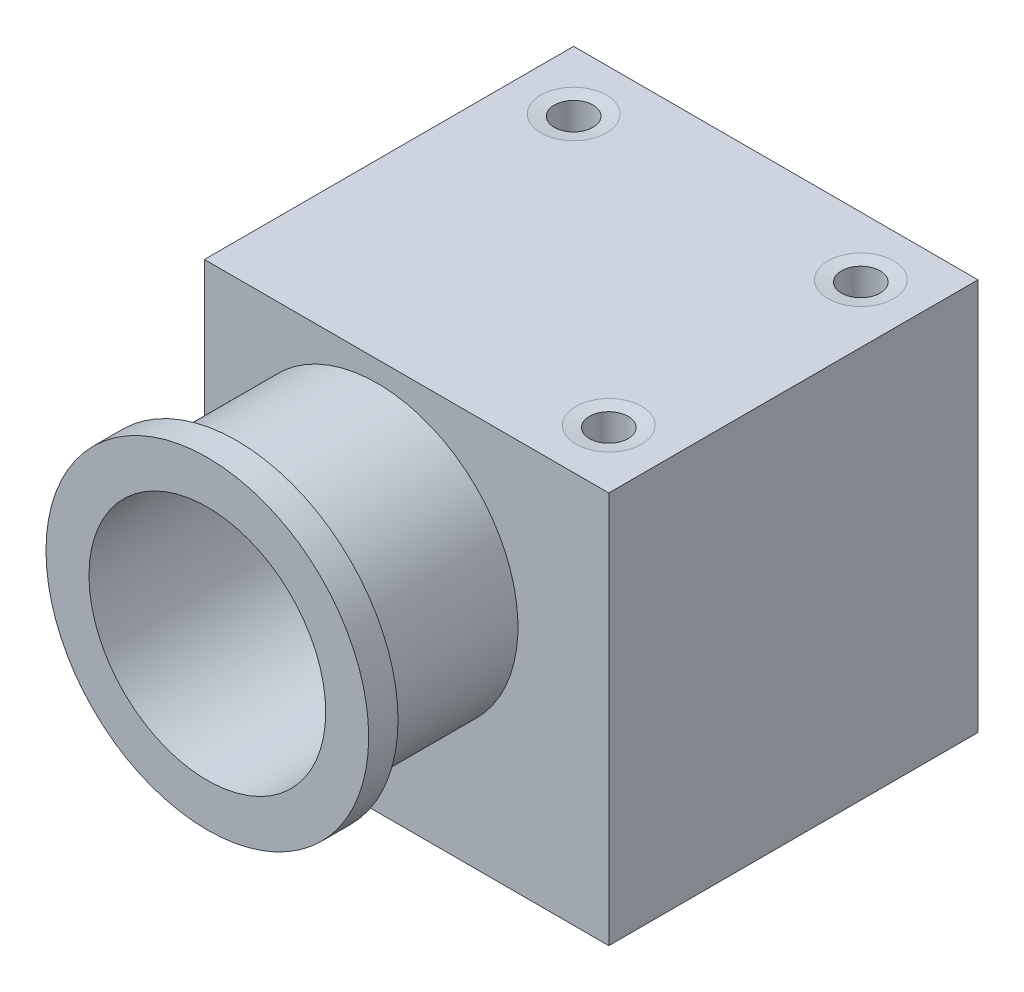
ISO-10303-21;
HEADER;
FILE_DESCRIPTION(('STEP AP214'),'2;1');
FILE_NAME('part.step','',(''),(''),'','','');
FILE_SCHEMA(('AUTOMOTIVE_DESIGN { 1 0 10303 214 1 1 1 1 }'));
ENDSEC;
DATA;
#1=APPLICATION_CONTEXT('core data for automotive mechanical design processes');
#2=APPLICATION_PROTOCOL_DEFINITION('international standard','automotive_design',2000,#1);
#3=PRODUCT_CONTEXT('',#1,'mechanical');
#4=PRODUCT('Part','Part','',(#3));
#5=PRODUCT_RELATED_PRODUCT_CATEGORY('part','',(#4));
#6=PRODUCT_DEFINITION_FORMATION('','',#4);
#7=PRODUCT_DEFINITION_CONTEXT('part definition',#1,'design');
#8=PRODUCT_DEFINITION('design','',#6,#7);
#9=PRODUCT_DEFINITION_SHAPE('','',#8);
#10=(LENGTH_UNIT() NAMED_UNIT(*) SI_UNIT(.MILLI.,.METRE.));
#11=(NAMED_UNIT(*) PLANE_ANGLE_UNIT() SI_UNIT($,.RADIAN.));
#12=(NAMED_UNIT(*) SI_UNIT($,.STERADIAN.) SOLID_ANGLE_UNIT());
#13=UNCERTAINTY_MEASURE_WITH_UNIT(LENGTH_MEASURE(1.E-05),#10,'distance_accuracy_value','');
#14=(GEOMETRIC_REPRESENTATION_CONTEXT(3) GLOBAL_UNCERTAINTY_ASSIGNED_CONTEXT((#13)) GLOBAL_UNIT_ASSIGNED_CONTEXT((#10,
#11,#12)) REPRESENTATION_CONTEXT('',''));
#15=CARTESIAN_POINT('',(0.,0.,0.));
#16=DIRECTION('',(0.,0.,1.));
#17=DIRECTION('',(1.,0.,0.));
#18=AXIS2_PLACEMENT_3D('',#15,#16,#17);
#19=CARTESIAN_POINT('',(0.,1.50369999999999,-18.288));
#20=DIRECTION('',(0.,0.,1.));
#21=DIRECTION('',(1.,0.,0.));
#22=AXIS2_PLACEMENT_3D('',#19,#20,#21);
#23=CYLINDRICAL_SURFACE('',#22,5.1308);
#24=CARTESIAN_POINT('',(0.,1.50369999999999,-18.2626));
#25=DIRECTION('',(0.,0.,-1.));
#26=DIRECTION('',(-1.,0.,0.));
#27=AXIS2_PLACEMENT_3D('',#24,#25,#26);
#28=CIRCLE('',#27,5.1308);
#29=CARTESIAN_POINT('',(-5.1308,1.50369999999999,-18.2626));
#30=VERTEX_POINT('',#29);
#31=EDGE_CURVE('E43',#30,#30,#28,.F.);
#32=ORIENTED_EDGE('',*,*,#31,.T.);
#33=EDGE_LOOP('',(#32));
#34=FACE_BOUND('',#33,.T.);
#35=CARTESIAN_POINT('',(0.,1.50369999999999,-18.288));
#36=DIRECTION('',(0.,0.,1.));
#37=DIRECTION('',(1.,0.,0.));
#38=AXIS2_PLACEMENT_3D('',#35,#36,#37);
#39=CIRCLE('',#38,5.1308);
#40=CARTESIAN_POINT('',(5.1308,1.50369999999999,-18.288));
#41=VERTEX_POINT('',#40);
#42=EDGE_CURVE('E200',#41,#41,#39,.T.);
#43=ORIENTED_EDGE('',*,*,#42,.F.);
#44=EDGE_LOOP('',(#43));
#45=FACE_BOUND('',#44,.T.);
#46=ADVANCED_FACE('F39',(#34,#45),#23,.F.);
#47=CARTESIAN_POINT('',(-7.493,-8.49630000000001,-24.1554));
#48=DIRECTION('',(1.,0.,0.));
#49=DIRECTION('',(0.,0.,-1.));
#50=AXIS2_PLACEMENT_3D('',#47,#48,#49);
#51=PLANE('',#50);
#52=DIRECTION('',(0.,1.,0.));
#53=VECTOR('',#52,1.);
#54=CARTESIAN_POINT('',(-7.493,-8.49630000000001,-23.368));
#55=LINE('',#54,#53);
#56=CARTESIAN_POINT('',(-7.493,-8.49630000000001,-23.368));
#57=VERTEX_POINT('',#56);
#58=CARTESIAN_POINT('',(-7.493,8.49629999999999,-23.368));
#59=VERTEX_POINT('',#58);
#60=EDGE_CURVE('E171',#57,#59,#55,.T.);
#61=ORIENTED_EDGE('',*,*,#60,.F.);
#62=DIRECTION('',(0.,0.,1.));
#63=VECTOR('',#62,1.);
#64=CARTESIAN_POINT('',(-7.493,-8.49630000000001,-24.1554));
#65=LINE('',#64,#63);
#66=CARTESIAN_POINT('',(-7.493,-8.49630000000001,-7.366));
#67=VERTEX_POINT('',#66);
#68=EDGE_CURVE('E48',#57,#67,#65,.T.);
#69=ORIENTED_EDGE('',*,*,#68,.T.);
#70=DIRECTION('',(0.,-1.,0.));
#71=VECTOR('',#70,1.);
#72=CARTESIAN_POINT('',(-7.493,8.49629999999999,-7.366));
#73=LINE('',#72,#71);
#74=CARTESIAN_POINT('',(-7.493,8.49629999999999,-7.366));
#75=VERTEX_POINT('',#74);
#76=EDGE_CURVE('E191',#75,#67,#73,.T.);
#77=ORIENTED_EDGE('',*,*,#76,.F.);
#78=DIRECTION('',(0.,0.,1.));
#79=VECTOR('',#78,1.);
#80=CARTESIAN_POINT('',(-7.493,8.49629999999999,-24.1554));
#81=LINE('',#80,#79);
#82=EDGE_CURVE('E11',#59,#75,#81,.T.);
#83=ORIENTED_EDGE('',*,*,#82,.F.);
#84=EDGE_LOOP('',(#61,#69,#77,#83));
#85=FACE_BOUND('',#84,.T.);
#86=ADVANCED_FACE('F41',(#85),#51,.F.);
#87=CARTESIAN_POINT('',(-7.493,8.49629999999999,-24.1554));
#88=DIRECTION('',(0.,-1.,0.));
#89=DIRECTION('',(0.,0.,-1.));
#90=AXIS2_PLACEMENT_3D('',#87,#88,#89);
#91=PLANE('',#90);
#92=CARTESIAN_POINT('',(7.493,8.49629999999999,-9.906));
#93=DIRECTION('',(0.,1.,0.));
#94=DIRECTION('',(0.,0.,1.));
#95=AXIS2_PLACEMENT_3D('',#92,#93,#94);
#96=CIRCLE('',#95,1.4224);
#97=CARTESIAN_POINT('',(7.493,8.49629999999999,-8.4836));
#98=VERTEX_POINT('',#97);
#99=EDGE_CURVE('E146',#98,#98,#96,.T.);
#100=ORIENTED_EDGE('',*,*,#99,.F.);
#101=EDGE_LOOP('',(#100));
#102=FACE_BOUND('',#101,.T.);
#103=CARTESIAN_POINT('',(7.493,8.49629999999999,-20.828));
#104=DIRECTION('',(0.,1.,0.));
#105=DIRECTION('',(0.,0.,1.));
#106=AXIS2_PLACEMENT_3D('',#103,#104,#105);
#107=CIRCLE('',#106,1.4224);
#108=CARTESIAN_POINT('',(7.493,8.49629999999999,-19.4056));
#109=VERTEX_POINT('',#108);
#110=EDGE_CURVE('E150',#109,#109,#107,.T.);
#111=ORIENTED_EDGE('',*,*,#110,.F.);
#112=EDGE_LOOP('',(#111));
#113=FACE_BOUND('',#112,.T.);
#114=CARTESIAN_POINT('',(-4.953,8.49629999999999,-20.828));
#115=DIRECTION('',(0.,1.,0.));
#116=DIRECTION('',(0.,0.,1.));
#117=AXIS2_PLACEMENT_3D('',#114,#115,#116);
#118=CIRCLE('',#117,1.4224);
#119=CARTESIAN_POINT('',(-4.953,8.49629999999999,-19.4056));
#120=VERTEX_POINT('',#119);
#121=EDGE_CURVE('E154',#120,#120,#118,.T.);
#122=ORIENTED_EDGE('',*,*,#121,.F.);
#123=EDGE_LOOP('',(#122));
#124=FACE_BOUND('',#123,.T.);
#125=DIRECTION('',(1.,0.,0.));
#126=VECTOR('',#125,1.);
#127=CARTESIAN_POINT('',(-7.493,8.49629999999999,-23.368));
#128=LINE('',#127,#126);
#129=CARTESIAN_POINT('',(10.033,8.49629999999999,-23.368));
#130=VERTEX_POINT('',#129);
#131=EDGE_CURVE('E173',#59,#130,#128,.T.);
#132=ORIENTED_EDGE('',*,*,#131,.F.);
#133=ORIENTED_EDGE('',*,*,#82,.T.);
#134=DIRECTION('',(-1.,0.,0.));
#135=VECTOR('',#134,1.);
#136=CARTESIAN_POINT('',(-7.493,8.49629999999999,-7.366));
#137=LINE('',#136,#135);
#138=CARTESIAN_POINT('',(10.033,8.49629999999999,-7.366));
#139=VERTEX_POINT('',#138);
#140=EDGE_CURVE('E197',#139,#75,#137,.T.);
#141=ORIENTED_EDGE('',*,*,#140,.F.);
#142=DIRECTION('',(0.,0.,1.));
#143=VECTOR('',#142,1.);
#144=CARTESIAN_POINT('',(10.033,8.49629999999999,-7.366));
#145=LINE('',#144,#143);
#146=EDGE_CURVE('E168',#130,#139,#145,.T.);
#147=ORIENTED_EDGE('',*,*,#146,.F.);
#148=EDGE_LOOP('',(#132,#133,#141,#147));
#149=FACE_BOUND('',#148,.T.);
#150=ADVANCED_FACE('F257',(#102,#113,#124,#149),#91,.F.);
#151=CARTESIAN_POINT('',(-7.493,-8.49630000000001,-24.1554));
#152=DIRECTION('',(0.,-1.,0.));
#153=DIRECTION('',(0.,0.,-1.));
#154=AXIS2_PLACEMENT_3D('',#151,#152,#153);
#155=PLANE('',#154);
#156=DIRECTION('',(0.,0.,1.));
#157=VECTOR('',#156,1.);
#158=CARTESIAN_POINT('',(6.59129999999998,-8.49630000000001,-18.2626));
#159=LINE('',#158,#157);
#160=CARTESIAN_POINT('',(6.59129999999998,-8.49630000000001,-18.2626));
#161=VERTEX_POINT('',#160);
#162=CARTESIAN_POINT('',(6.59129999999998,-8.49630000000001,-17.4752));
#163=VERTEX_POINT('',#162);
#164=EDGE_CURVE('E56',#161,#163,#159,.T.);
#165=ORIENTED_EDGE('',*,*,#164,.F.);
#166=DIRECTION('',(1.,0.,0.));
#167=VECTOR('',#166,1.);
#168=CARTESIAN_POINT('',(-6.59130000000002,-8.49630000000001,-18.2626));
#169=LINE('',#168,#167);
#170=CARTESIAN_POINT('',(-6.59130000000002,-8.49630000000001,-18.2626));
#171=VERTEX_POINT('',#170);
#172=EDGE_CURVE('E127',#171,#161,#169,.T.);
#173=ORIENTED_EDGE('',*,*,#172,.F.);
#174=DIRECTION('',(0.,0.,-1.));
#175=VECTOR('',#174,1.);
#176=CARTESIAN_POINT('',(-6.59130000000002,-8.49630000000001,-18.2626));
#177=LINE('',#176,#175);
#178=CARTESIAN_POINT('',(-6.59130000000002,-8.49630000000001,-17.4752));
#179=VERTEX_POINT('',#178);
#180=EDGE_CURVE('E130',#179,#171,#177,.T.);
#181=ORIENTED_EDGE('',*,*,#180,.F.);
#182=DIRECTION('',(-1.,0.,0.));
#183=VECTOR('',#182,1.);
#184=CARTESIAN_POINT('',(-6.59130000000002,-8.49630000000001,-17.4752));
#185=LINE('',#184,#183);
#186=EDGE_CURVE('E136',#163,#179,#185,.T.);
#187=ORIENTED_EDGE('',*,*,#186,.F.);
#188=EDGE_LOOP('',(#165,#173,#181,#187));
#189=FACE_BOUND('',#188,.T.);
#190=CARTESIAN_POINT('',(7.493,-8.49630000000001,-9.906));
#191=DIRECTION('',(0.,-1.,0.));
#192=DIRECTION('',(0.,0.,-1.));
#193=AXIS2_PLACEMENT_3D('',#190,#191,#192);
#194=CIRCLE('',#193,0.838200000000001);
#195=CARTESIAN_POINT('',(7.493,-8.49630000000001,-10.7442));
#196=VERTEX_POINT('',#195);
#197=EDGE_CURVE('E220',#196,#196,#194,.T.);
#198=ORIENTED_EDGE('',*,*,#197,.F.);
#199=EDGE_LOOP('',(#198));
#200=FACE_BOUND('',#199,.T.);
#201=CARTESIAN_POINT('',(7.493,-8.49630000000001,-20.828));
#202=DIRECTION('',(0.,-1.,0.));
#203=DIRECTION('',(0.,0.,-1.));
#204=AXIS2_PLACEMENT_3D('',#201,#202,#203);
#205=CIRCLE('',#204,0.838200000000001);
#206=CARTESIAN_POINT('',(7.493,-8.49630000000001,-21.6662));
#207=VERTEX_POINT('',#206);
#208=EDGE_CURVE('E217',#207,#207,#205,.T.);
#209=ORIENTED_EDGE('',*,*,#208,.F.);
#210=EDGE_LOOP('',(#209));
#211=FACE_BOUND('',#210,.T.);
#212=CARTESIAN_POINT('',(-4.953,-8.49630000000001,-20.828));
#213=DIRECTION('',(0.,-1.,0.));
#214=DIRECTION('',(0.,0.,-1.));
#215=AXIS2_PLACEMENT_3D('',#212,#213,#214);
#216=CIRCLE('',#215,0.8382);
#217=CARTESIAN_POINT('',(-4.953,-8.49630000000001,-21.6662));
#218=VERTEX_POINT('',#217);
#219=EDGE_CURVE('E162',#218,#218,#216,.T.);
#220=ORIENTED_EDGE('',*,*,#219,.F.);
#221=EDGE_LOOP('',(#220));
#222=FACE_BOUND('',#221,.T.);
#223=ORIENTED_EDGE('',*,*,#68,.F.);
#224=DIRECTION('',(-1.,0.,0.));
#225=VECTOR('',#224,1.);
#226=CARTESIAN_POINT('',(-7.493,-8.49630000000001,-23.368));
#227=LINE('',#226,#225);
#228=CARTESIAN_POINT('',(10.033,-8.49630000000001,-23.368));
#229=VERTEX_POINT('',#228);
#230=EDGE_CURVE('E175',#229,#57,#227,.T.);
#231=ORIENTED_EDGE('',*,*,#230,.F.);
#232=DIRECTION('',(0.,0.,-1.));
#233=VECTOR('',#232,1.);
#234=CARTESIAN_POINT('',(10.033,-8.49630000000001,-7.366));
#235=LINE('',#234,#233);
#236=CARTESIAN_POINT('',(10.033,-8.49630000000001,-7.366));
#237=VERTEX_POINT('',#236);
#238=EDGE_CURVE('E161',#237,#229,#235,.T.);
#239=ORIENTED_EDGE('',*,*,#238,.F.);
#240=DIRECTION('',(1.,0.,0.));
#241=VECTOR('',#240,1.);
#242=CARTESIAN_POINT('',(-7.493,-8.49630000000001,-7.366));
#243=LINE('',#242,#241);
#244=EDGE_CURVE('E195',#67,#237,#243,.T.);
#245=ORIENTED_EDGE('',*,*,#244,.F.);
#246=EDGE_LOOP('',(#223,#231,#239,#245));
#247=FACE_BOUND('',#246,.T.);
#248=ADVANCED_FACE('F314',(#189,#200,#211,#222,#247),#155,.T.);
#249=CARTESIAN_POINT('',(0.,1.50369999999999,-24.1554));
#250=DIRECTION('',(0.,0.,1.));
#251=DIRECTION('',(1.,0.,0.));
#252=AXIS2_PLACEMENT_3D('',#249,#250,#251);
#253=CYLINDRICAL_SURFACE('',#252,1.4224);
#254=CARTESIAN_POINT('',(0.,1.50369999999999,-19.558));
#255=DIRECTION('',(0.,0.,1.));
#256=DIRECTION('',(1.,0.,0.));
#257=AXIS2_PLACEMENT_3D('',#254,#255,#256);
#258=CIRCLE('',#257,1.4224);
#259=CARTESIAN_POINT('',(1.4224,1.50369999999999,-19.558));
#260=VERTEX_POINT('',#259);
#261=EDGE_CURVE('E207',#260,#260,#258,.F.);
#262=ORIENTED_EDGE('',*,*,#261,.F.);
#263=EDGE_LOOP('',(#262));
#264=FACE_BOUND('',#263,.T.);
#265=CARTESIAN_POINT('',(0.,1.50369999999999,-23.368));
#266=DIRECTION('',(0.,0.,-1.));
#267=DIRECTION('',(-1.,0.,0.));
#268=AXIS2_PLACEMENT_3D('',#265,#266,#267);
#269=CIRCLE('',#268,1.4224);
#270=CARTESIAN_POINT('',(-1.4224,1.50369999999999,-23.368));
#271=VERTEX_POINT('',#270);
#272=EDGE_CURVE('E177',#271,#271,#269,.F.);
#273=ORIENTED_EDGE('',*,*,#272,.F.);
#274=EDGE_LOOP('',(#273));
#275=FACE_BOUND('',#274,.T.);
#276=ADVANCED_FACE('F270',(#264,#275),#253,.F.);
#277=CARTESIAN_POINT('',(0.,0.,-7.366));
#278=DIRECTION('',(0.,0.,1.));
#279=DIRECTION('',(1.,0.,0.));
#280=AXIS2_PLACEMENT_3D('',#277,#278,#279);
#281=PLANE('',#280);
#282=ORIENTED_EDGE('',*,*,#76,.T.);
#283=ORIENTED_EDGE('',*,*,#244,.T.);
#284=DIRECTION('',(0.,-1.,0.));
#285=VECTOR('',#284,1.);
#286=CARTESIAN_POINT('',(10.033,8.49629999999999,-7.366));
#287=LINE('',#286,#285);
#288=EDGE_CURVE('E158',#139,#237,#287,.T.);
#289=ORIENTED_EDGE('',*,*,#288,.F.);
#290=ORIENTED_EDGE('',*,*,#140,.T.);
#291=EDGE_LOOP('',(#282,#283,#289,#290));
#292=FACE_BOUND('',#291,.T.);
#293=CARTESIAN_POINT('',(0.,1.50369999999999,-7.366));
#294=DIRECTION('',(0.,0.,1.));
#295=DIRECTION('',(1.,0.,0.));
#296=AXIS2_PLACEMENT_3D('',#293,#294,#295);
#297=CIRCLE('',#296,6.096);
#298=CARTESIAN_POINT('',(-6.096,1.50369999999999,-7.366));
#299=VERTEX_POINT('',#298);
#300=EDGE_CURVE('E185',#299,#299,#297,.T.);
#301=ORIENTED_EDGE('',*,*,#300,.F.);
#302=EDGE_LOOP('',(#301));
#303=FACE_BOUND('',#302,.T.);
#304=ADVANCED_FACE('F262',(#292,#303),#281,.T.);
#305=CARTESIAN_POINT('',(0.,1.50369999999999,-17.4752));
#306=DIRECTION('',(0.,0.,1.));
#307=DIRECTION('',(1.,0.,0.));
#308=AXIS2_PLACEMENT_3D('',#305,#306,#307);
#309=CIRCLE('',#308,5.1308);
#310=CARTESIAN_POINT('',(5.1308,1.50369999999999,-17.4752));
#311=VERTEX_POINT('',#310);
#312=EDGE_CURVE('E142',#311,#311,#309,.F.);
#313=ORIENTED_EDGE('',*,*,#312,.T.);
#314=EDGE_LOOP('',(#313));
#315=FACE_BOUND('',#314,.T.);
#316=CARTESIAN_POINT('',(0.,1.50369999999999,0.));
#317=DIRECTION('',(0.,0.,1.));
#318=DIRECTION('',(1.,0.,0.));
#319=AXIS2_PLACEMENT_3D('',#316,#317,#318);
#320=CIRCLE('',#319,5.1308);
#321=CARTESIAN_POINT('',(5.1308,1.50369999999999,0.));
#322=VERTEX_POINT('',#321);
#323=EDGE_CURVE('E178',#322,#322,#320,.T.);
#324=ORIENTED_EDGE('',*,*,#323,.T.);
#325=EDGE_LOOP('',(#324));
#326=FACE_BOUND('',#325,.T.);
#327=ADVANCED_FACE('F253',(#315,#326),#23,.F.);
#328=CARTESIAN_POINT('',(0.,1.50369999999999,-19.558));
#329=DIRECTION('',(0.,0.,1.));
#330=DIRECTION('',(1.,0.,0.));
#331=AXIS2_PLACEMENT_3D('',#328,#329,#330);
#332=CYLINDRICAL_SURFACE('',#331,3.2639);
#333=CARTESIAN_POINT('',(0.,1.50369999999999,-19.558));
#334=DIRECTION('',(0.,0.,1.));
#335=DIRECTION('',(1.,0.,0.));
#336=AXIS2_PLACEMENT_3D('',#333,#334,#335);
#337=CIRCLE('',#336,3.2639);
#338=CARTESIAN_POINT('',(3.2639,1.50369999999999,-19.558));
#339=VERTEX_POINT('',#338);
#340=EDGE_CURVE('E204',#339,#339,#337,.T.);
#341=ORIENTED_EDGE('',*,*,#340,.F.);
#342=EDGE_LOOP('',(#341));
#343=FACE_BOUND('',#342,.T.);
#344=CARTESIAN_POINT('',(0.,1.50369999999999,-18.288));
#345=DIRECTION('',(0.,0.,1.));
#346=DIRECTION('',(1.,0.,0.));
#347=AXIS2_PLACEMENT_3D('',#344,#345,#346);
#348=CIRCLE('',#347,3.2639);
#349=CARTESIAN_POINT('',(3.2639,1.50369999999999,-18.288));
#350=VERTEX_POINT('',#349);
#351=EDGE_CURVE('E203',#350,#350,#348,.F.);
#352=ORIENTED_EDGE('',*,*,#351,.F.);
#353=EDGE_LOOP('',(#352));
#354=FACE_BOUND('',#353,.T.);
#355=ADVANCED_FACE('F261',(#343,#354),#332,.F.);
#356=CARTESIAN_POINT('',(0.,1.50369999999999,-19.558));
#357=DIRECTION('',(0.,0.,1.));
#358=DIRECTION('',(1.,0.,0.));
#359=AXIS2_PLACEMENT_3D('',#356,#357,#358);
#360=PLANE('',#359);
#361=ORIENTED_EDGE('',*,*,#340,.T.);
#362=EDGE_LOOP('',(#361));
#363=FACE_BOUND('',#362,.T.);
#364=ORIENTED_EDGE('',*,*,#261,.T.);
#365=EDGE_LOOP('',(#364));
#366=FACE_BOUND('',#365,.T.);
#367=ADVANCED_FACE('F267',(#363,#366),#360,.T.);
#368=CARTESIAN_POINT('',(0.,1.50369999999999,-18.288));
#369=DIRECTION('',(0.,0.,1.));
#370=DIRECTION('',(1.,0.,0.));
#371=AXIS2_PLACEMENT_3D('',#368,#369,#370);
#372=PLANE('',#371);
#373=ORIENTED_EDGE('',*,*,#42,.T.);
#374=EDGE_LOOP('',(#373));
#375=FACE_BOUND('',#374,.T.);
#376=ORIENTED_EDGE('',*,*,#351,.T.);
#377=EDGE_LOOP('',(#376));
#378=FACE_BOUND('',#377,.T.);
#379=ADVANCED_FACE('F296',(#375,#378),#372,.T.);
#380=CARTESIAN_POINT('',(0.,1.50369999999999,-1.27));
#381=DIRECTION('',(0.,0.,-1.));
#382=DIRECTION('',(-1.,0.,0.));
#383=AXIS2_PLACEMENT_3D('',#380,#381,#382);
#384=CYLINDRICAL_SURFACE('',#383,6.096);
#385=CARTESIAN_POINT('',(0.,1.50369999999999,-1.27));
#386=DIRECTION('',(0.,0.,1.));
#387=DIRECTION('',(1.,0.,0.));
#388=AXIS2_PLACEMENT_3D('',#385,#386,#387);
#389=CIRCLE('',#388,6.096);
#390=CARTESIAN_POINT('',(-6.096,1.50369999999999,-1.27));
#391=VERTEX_POINT('',#390);
#392=EDGE_CURVE('E188',#391,#391,#389,.T.);
#393=CARTESIAN_POINT('',(-6.096,1.50369999999999,-1.27));
#394=CARTESIAN_POINT('',(-6.096,1.50369999999999,-1.3335));
#395=CARTESIAN_POINT('',(-6.096,1.50369999999999,-1.397));
#396=CARTESIAN_POINT('',(-6.096,1.50369999999999,-1.524));
#397=CARTESIAN_POINT('',(-6.096,1.50369999999999,-1.5875));
#398=CARTESIAN_POINT('',(-6.096,1.50369999999999,-1.7145));
#399=CARTESIAN_POINT('',(-6.096,1.50369999999999,-1.778));
#400=CARTESIAN_POINT('',(-6.096,1.50369999999999,-1.905));
#401=CARTESIAN_POINT('',(-6.096,1.50369999999999,-1.9685));
#402=CARTESIAN_POINT('',(-6.096,1.50369999999999,-2.0955));
#403=CARTESIAN_POINT('',(-6.096,1.50369999999999,-2.159));
#404=CARTESIAN_POINT('',(-6.096,1.50369999999999,-2.286));
#405=CARTESIAN_POINT('',(-6.096,1.50369999999999,-2.3495));
#406=CARTESIAN_POINT('',(-6.096,1.50369999999999,-2.4765));
#407=CARTESIAN_POINT('',(-6.096,1.50369999999999,-2.54));
#408=CARTESIAN_POINT('',(-6.096,1.50369999999999,-2.667));
#409=CARTESIAN_POINT('',(-6.096,1.50369999999999,-2.7305));
#410=CARTESIAN_POINT('',(-6.096,1.50369999999999,-2.8575));
#411=CARTESIAN_POINT('',(-6.096,1.50369999999999,-2.921));
#412=CARTESIAN_POINT('',(-6.096,1.50369999999999,-3.048));
#413=CARTESIAN_POINT('',(-6.096,1.50369999999999,-3.1115));
#414=CARTESIAN_POINT('',(-6.096,1.50369999999999,-3.2385));
#415=CARTESIAN_POINT('',(-6.096,1.50369999999999,-3.302));
#416=CARTESIAN_POINT('',(-6.096,1.50369999999999,-3.429));
#417=CARTESIAN_POINT('',(-6.096,1.50369999999999,-3.4925));
#418=CARTESIAN_POINT('',(-6.096,1.50369999999999,-3.6195));
#419=CARTESIAN_POINT('',(-6.096,1.50369999999999,-3.683));
#420=CARTESIAN_POINT('',(-6.096,1.50369999999999,-3.81));
#421=CARTESIAN_POINT('',(-6.096,1.50369999999999,-3.8735));
#422=CARTESIAN_POINT('',(-6.096,1.50369999999999,-4.0005));
#423=CARTESIAN_POINT('',(-6.096,1.50369999999999,-4.064));
#424=CARTESIAN_POINT('',(-6.096,1.50369999999999,-4.191));
#425=CARTESIAN_POINT('',(-6.096,1.50369999999999,-4.2545));
#426=CARTESIAN_POINT('',(-6.096,1.50369999999999,-4.3815));
#427=CARTESIAN_POINT('',(-6.096,1.50369999999999,-4.445));
#428=CARTESIAN_POINT('',(-6.096,1.50369999999999,-4.572));
#429=CARTESIAN_POINT('',(-6.096,1.50369999999999,-4.6355));
#430=CARTESIAN_POINT('',(-6.096,1.50369999999999,-4.7625));
#431=CARTESIAN_POINT('',(-6.096,1.50369999999999,-4.826));
#432=CARTESIAN_POINT('',(-6.096,1.50369999999999,-4.953));
#433=CARTESIAN_POINT('',(-6.096,1.50369999999999,-5.0165));
#434=CARTESIAN_POINT('',(-6.096,1.50369999999999,-5.1435));
#435=CARTESIAN_POINT('',(-6.096,1.50369999999999,-5.207));
#436=CARTESIAN_POINT('',(-6.096,1.50369999999999,-5.334));
#437=CARTESIAN_POINT('',(-6.096,1.50369999999999,-5.3975));
#438=CARTESIAN_POINT('',(-6.096,1.50369999999999,-5.5245));
#439=CARTESIAN_POINT('',(-6.096,1.50369999999999,-5.588));
#440=CARTESIAN_POINT('',(-6.096,1.50369999999999,-5.715));
#441=CARTESIAN_POINT('',(-6.096,1.50369999999999,-5.7785));
#442=CARTESIAN_POINT('',(-6.096,1.50369999999999,-5.9055));
#443=CARTESIAN_POINT('',(-6.096,1.50369999999999,-5.969));
#444=CARTESIAN_POINT('',(-6.096,1.50369999999999,-6.096));
#445=CARTESIAN_POINT('',(-6.096,1.50369999999999,-6.1595));
#446=CARTESIAN_POINT('',(-6.096,1.50369999999999,-6.2865));
#447=CARTESIAN_POINT('',(-6.096,1.50369999999999,-6.35));
#448=CARTESIAN_POINT('',(-6.096,1.50369999999999,-6.477));
#449=CARTESIAN_POINT('',(-6.096,1.50369999999999,-6.5405));
#450=CARTESIAN_POINT('',(-6.096,1.50369999999999,-6.6675));
#451=CARTESIAN_POINT('',(-6.096,1.50369999999999,-6.731));
#452=CARTESIAN_POINT('',(-6.096,1.50369999999999,-6.858));
#453=CARTESIAN_POINT('',(-6.096,1.50369999999999,-6.9215));
#454=CARTESIAN_POINT('',(-6.096,1.50369999999999,-7.0485));
#455=CARTESIAN_POINT('',(-6.096,1.50369999999999,-7.112));
#456=CARTESIAN_POINT('',(-6.096,1.50369999999999,-7.239));
#457=CARTESIAN_POINT('',(-6.096,1.50369999999999,-7.3025));
#458=CARTESIAN_POINT('',(-6.096,1.50369999999999,-7.366));
#459=B_SPLINE_CURVE_WITH_KNOTS('',3,(#393,#394,#395,#396,#397,#398,#399,#400,#401,#402,#403,
#404,#405,#406,#407,#408,#409,#410,#411,#412,#413,#414,#415,#416,#417,#418,#419,#420,#421,#422,
#423,#424,#425,#426,#427,#428,#429,#430,#431,#432,#433,#434,#435,#436,#437,#438,#439,#440,#441,
#442,#443,#444,#445,#446,#447,#448,#449,#450,#451,#452,#453,#454,#455,#456,#457,#458),
.UNSPECIFIED.,.F.,.F.,(4,2,2,2,2,2,2,2,2,2,2,2,2,2,2,2,2,2,2,2,2,2,2,2,2,2,2,2,2,2,2,2,4),(0.,
0.1905,0.381,0.5715,0.762,0.9525,1.143,1.3335,1.524,1.7145,1.905,2.0955,2.286,2.4765,2.667,
2.8575,3.048,3.2385,3.429,3.6195,3.81,4.0005,4.191,4.3815,4.572,4.7625,4.953,5.1435,5.334,
5.5245,5.715,5.9055,6.096),.UNSPECIFIED.);
#460=EDGE_CURVE('BSEAM289',#391,#299,#459,.T.);
#461=ORIENTED_EDGE('',*,*,#392,.F.);
#462=ORIENTED_EDGE('',*,*,#300,.T.);
#463=ORIENTED_EDGE('',*,*,#460,.T.);
#464=ORIENTED_EDGE('',*,*,#460,.F.);
#465=EDGE_LOOP('',(#461,#463,#462,#464));
#466=FACE_BOUND('',#465,.T.);
#467=ADVANCED_FACE('F289',(#466),#384,.T.);
#468=CARTESIAN_POINT('',(0.,1.50369999999999,-1.27));
#469=DIRECTION('',(0.,0.,1.));
#470=DIRECTION('',(1.,0.,0.));
#471=AXIS2_PLACEMENT_3D('',#468,#469,#470);
#472=PLANE('',#471);
#473=CARTESIAN_POINT('',(0.,1.50369999999999,-1.27));
#474=DIRECTION('',(0.,0.,1.));
#475=DIRECTION('',(1.,0.,0.));
#476=AXIS2_PLACEMENT_3D('',#473,#474,#475);
#477=CIRCLE('',#476,6.9926);
#478=CARTESIAN_POINT('',(6.9926,1.50369999999999,-1.27));
#479=VERTEX_POINT('',#478);
#480=EDGE_CURVE('E181',#479,#479,#477,.T.);
#481=ORIENTED_EDGE('',*,*,#480,.F.);
#482=EDGE_LOOP('',(#481));
#483=FACE_BOUND('',#482,.T.);
#484=ORIENTED_EDGE('',*,*,#392,.T.);
#485=EDGE_LOOP('',(#484));
#486=FACE_BOUND('',#485,.T.);
#487=ADVANCED_FACE('F279',(#483,#486),#472,.F.);
#488=CARTESIAN_POINT('',(0.,1.50369999999999,0.));
#489=DIRECTION('',(0.,0.,1.));
#490=DIRECTION('',(1.,0.,0.));
#491=AXIS2_PLACEMENT_3D('',#488,#489,#490);
#492=PLANE('',#491);
#493=CARTESIAN_POINT('',(0.,1.50369999999999,0.));
#494=DIRECTION('',(0.,0.,1.));
#495=DIRECTION('',(1.,0.,0.));
#496=AXIS2_PLACEMENT_3D('',#493,#494,#495);
#497=CIRCLE('',#496,6.9926);
#498=CARTESIAN_POINT('',(6.9926,1.50369999999999,0.));
#499=VERTEX_POINT('',#498);
#500=EDGE_CURVE('E182',#499,#499,#497,.T.);
#501=ORIENTED_EDGE('',*,*,#500,.T.);
#502=EDGE_LOOP('',(#501));
#503=FACE_BOUND('',#502,.T.);
#504=ORIENTED_EDGE('',*,*,#323,.F.);
#505=EDGE_LOOP('',(#504));
#506=FACE_BOUND('',#505,.T.);
#507=ADVANCED_FACE('F276',(#503,#506),#492,.T.);
#508=CARTESIAN_POINT('',(0.,1.50369999999999,0.));
#509=DIRECTION('',(0.,0.,-1.));
#510=DIRECTION('',(-1.,0.,0.));
#511=AXIS2_PLACEMENT_3D('',#508,#509,#510);
#512=CYLINDRICAL_SURFACE('',#511,6.9926);
#513=ORIENTED_EDGE('',*,*,#500,.F.);
#514=EDGE_LOOP('',(#513));
#515=FACE_BOUND('',#514,.T.);
#516=ORIENTED_EDGE('',*,*,#480,.T.);
#517=EDGE_LOOP('',(#516));
#518=FACE_BOUND('',#517,.T.);
#519=ADVANCED_FACE('F278',(#515,#518),#512,.T.);
#520=CARTESIAN_POINT('',(0.,0.,-23.368));
#521=DIRECTION('',(0.,0.,-1.));
#522=DIRECTION('',(-1.,0.,0.));
#523=AXIS2_PLACEMENT_3D('',#520,#521,#522);
#524=PLANE('',#523);
#525=ORIENTED_EDGE('',*,*,#60,.T.);
#526=ORIENTED_EDGE('',*,*,#131,.T.);
#527=DIRECTION('',(0.,1.,0.));
#528=VECTOR('',#527,1.);
#529=CARTESIAN_POINT('',(10.033,8.49629999999999,-23.368));
#530=LINE('',#529,#528);
#531=EDGE_CURVE('E165',#229,#130,#530,.T.);
#532=ORIENTED_EDGE('',*,*,#531,.F.);
#533=ORIENTED_EDGE('',*,*,#230,.T.);
#534=EDGE_LOOP('',(#525,#526,#532,#533));
#535=FACE_BOUND('',#534,.T.);
#536=ORIENTED_EDGE('',*,*,#272,.T.);
#537=EDGE_LOOP('',(#536));
#538=FACE_BOUND('',#537,.T.);
#539=ADVANCED_FACE('F286',(#535,#538),#524,.T.);
#540=CARTESIAN_POINT('',(10.033,0.,0.));
#541=DIRECTION('',(1.,0.,0.));
#542=DIRECTION('',(0.,0.,-1.));
#543=AXIS2_PLACEMENT_3D('',#540,#541,#542);
#544=PLANE('',#543);
#545=ORIENTED_EDGE('',*,*,#288,.T.);
#546=ORIENTED_EDGE('',*,*,#238,.T.);
#547=ORIENTED_EDGE('',*,*,#531,.T.);
#548=ORIENTED_EDGE('',*,*,#146,.T.);
#549=EDGE_LOOP('',(#545,#546,#547,#548));
#550=FACE_BOUND('',#549,.T.);
#551=ADVANCED_FACE('F339',(#550),#544,.T.);
#552=CARTESIAN_POINT('',(-4.953,-11.8237,-20.828));
#553=DIRECTION('',(0.,1.,0.));
#554=DIRECTION('',(0.,0.,1.));
#555=AXIS2_PLACEMENT_3D('',#552,#553,#554);
#556=CYLINDRICAL_SURFACE('',#555,0.8382);
#557=CARTESIAN_POINT('',(-4.953,8.41419604436686,-20.828));
#558=DIRECTION('',(0.,1.,0.));
#559=DIRECTION('',(0.,0.,1.));
#560=AXIS2_PLACEMENT_3D('',#557,#558,#559);
#561=CIRCLE('',#560,0.8382);
#562=CARTESIAN_POINT('',(-4.953,8.41419604436686,-19.9898));
#563=VERTEX_POINT('',#562);
#564=EDGE_CURVE('E157',#563,#563,#561,.T.);
#565=ORIENTED_EDGE('',*,*,#564,.T.);
#566=EDGE_LOOP('',(#565));
#567=FACE_BOUND('',#566,.T.);
#568=ORIENTED_EDGE('',*,*,#219,.T.);
#569=EDGE_LOOP('',(#568));
#570=FACE_BOUND('',#569,.T.);
#571=ADVANCED_FACE('F347',(#567,#570),#556,.F.);
#572=CARTESIAN_POINT('',(7.493,-11.8237,-20.828));
#573=DIRECTION('',(0.,1.,0.));
#574=DIRECTION('',(0.,0.,1.));
#575=AXIS2_PLACEMENT_3D('',#572,#573,#574);
#576=CYLINDRICAL_SURFACE('',#575,0.838200000000001);
#577=CARTESIAN_POINT('',(7.493,8.41419604436686,-20.828));
#578=DIRECTION('',(0.,1.,0.));
#579=DIRECTION('',(0.,0.,1.));
#580=AXIS2_PLACEMENT_3D('',#577,#578,#579);
#581=CIRCLE('',#580,0.838200000000001);
#582=CARTESIAN_POINT('',(7.493,8.41419604436686,-19.9898));
#583=VERTEX_POINT('',#582);
#584=EDGE_CURVE('E153',#583,#583,#581,.T.);
#585=ORIENTED_EDGE('',*,*,#584,.T.);
#586=EDGE_LOOP('',(#585));
#587=FACE_BOUND('',#586,.T.);
#588=ORIENTED_EDGE('',*,*,#208,.T.);
#589=EDGE_LOOP('',(#588));
#590=FACE_BOUND('',#589,.T.);
#591=ADVANCED_FACE('F351',(#587,#590),#576,.F.);
#592=CARTESIAN_POINT('',(7.493,-11.8237,-9.906));
#593=DIRECTION('',(0.,1.,0.));
#594=DIRECTION('',(0.,0.,1.));
#595=AXIS2_PLACEMENT_3D('',#592,#593,#594);
#596=CYLINDRICAL_SURFACE('',#595,0.838200000000001);
#597=CARTESIAN_POINT('',(7.493,8.41419604436686,-9.906));
#598=DIRECTION('',(0.,1.,0.));
#599=DIRECTION('',(0.,0.,1.));
#600=AXIS2_PLACEMENT_3D('',#597,#598,#599);
#601=CIRCLE('',#600,0.838200000000001);
#602=CARTESIAN_POINT('',(7.493,8.41419604436686,-9.0678));
#603=VERTEX_POINT('',#602);
#604=EDGE_CURVE('E149',#603,#603,#601,.T.);
#605=ORIENTED_EDGE('',*,*,#604,.T.);
#606=EDGE_LOOP('',(#605));
#607=FACE_BOUND('',#606,.T.);
#608=ORIENTED_EDGE('',*,*,#197,.T.);
#609=EDGE_LOOP('',(#608));
#610=FACE_BOUND('',#609,.T.);
#611=ADVANCED_FACE('F357',(#607,#610),#596,.F.);
#612=CARTESIAN_POINT('',(-4.953,8.49629999999999,-20.828));
#613=DIRECTION('',(0.,1.,0.));
#614=DIRECTION('',(0.,0.,1.));
#615=AXIS2_PLACEMENT_3D('',#612,#613,#614);
#616=CONICAL_SURFACE('',#615,1.4224,1.43116998663535);
#617=ORIENTED_EDGE('',*,*,#121,.T.);
#618=EDGE_LOOP('',(#617));
#619=FACE_BOUND('',#618,.T.);
#620=ORIENTED_EDGE('',*,*,#564,.F.);
#621=EDGE_LOOP('',(#620));
#622=FACE_BOUND('',#621,.T.);
#623=ADVANCED_FACE('F361',(#619,#622),#616,.F.);
#624=CARTESIAN_POINT('',(7.493,8.49629999999999,-20.828));
#625=DIRECTION('',(0.,1.,0.));
#626=DIRECTION('',(0.,0.,1.));
#627=AXIS2_PLACEMENT_3D('',#624,#625,#626);
#628=CONICAL_SURFACE('',#627,1.4224,1.43116998663535);
#629=ORIENTED_EDGE('',*,*,#110,.T.);
#630=EDGE_LOOP('',(#629));
#631=FACE_BOUND('',#630,.T.);
#632=ORIENTED_EDGE('',*,*,#584,.F.);
#633=EDGE_LOOP('',(#632));
#634=FACE_BOUND('',#633,.T.);
#635=ADVANCED_FACE('F246',(#631,#634),#628,.F.);
#636=CARTESIAN_POINT('',(7.493,8.49629999999999,-9.906));
#637=DIRECTION('',(0.,1.,0.));
#638=DIRECTION('',(0.,0.,1.));
#639=AXIS2_PLACEMENT_3D('',#636,#637,#638);
#640=CONICAL_SURFACE('',#639,1.4224,1.43116998663535);
#641=ORIENTED_EDGE('',*,*,#99,.T.);
#642=EDGE_LOOP('',(#641));
#643=FACE_BOUND('',#642,.T.);
#644=ORIENTED_EDGE('',*,*,#604,.F.);
#645=EDGE_LOOP('',(#644));
#646=FACE_BOUND('',#645,.T.);
#647=ADVANCED_FACE('F238',(#643,#646),#640,.F.);
#648=CARTESIAN_POINT('',(-6.59130000000002,7.75969999999999,-18.2626));
#649=DIRECTION('',(0.,0.,-1.));
#650=DIRECTION('',(-1.,0.,0.));
#651=AXIS2_PLACEMENT_3D('',#648,#649,#650);
#652=PLANE('',#651);
#653=ORIENTED_EDGE('',*,*,#172,.T.);
#654=DIRECTION('',(0.,-1.,0.));
#655=VECTOR('',#654,1.);
#656=CARTESIAN_POINT('',(6.59129999999998,7.75969999999999,-18.2626));
#657=LINE('',#656,#655);
#658=CARTESIAN_POINT('',(6.59129999999998,7.75969999999999,-18.2626));
#659=VERTEX_POINT('',#658);
#660=EDGE_CURVE('E140',#659,#161,#657,.T.);
#661=ORIENTED_EDGE('',*,*,#660,.F.);
#662=DIRECTION('',(1.,0.,0.));
#663=VECTOR('',#662,1.);
#664=CARTESIAN_POINT('',(-6.59130000000002,7.75969999999999,-18.2626));
#665=LINE('',#664,#663);
#666=CARTESIAN_POINT('',(-6.59130000000002,7.75969999999999,-18.2626));
#667=VERTEX_POINT('',#666);
#668=EDGE_CURVE('E114',#667,#659,#665,.T.);
#669=ORIENTED_EDGE('',*,*,#668,.F.);
#670=DIRECTION('',(0.,-1.,0.));
#671=VECTOR('',#670,1.);
#672=CARTESIAN_POINT('',(-6.59130000000002,7.75969999999999,-18.2626));
#673=LINE('',#672,#671);
#674=EDGE_CURVE('E143',#667,#171,#673,.T.);
#675=ORIENTED_EDGE('',*,*,#674,.T.);
#676=EDGE_LOOP('',(#653,#661,#669,#675));
#677=FACE_BOUND('',#676,.T.);
#678=ORIENTED_EDGE('',*,*,#31,.F.);
#679=EDGE_LOOP('',(#678));
#680=FACE_BOUND('',#679,.T.);
#681=ADVANCED_FACE('F236',(#677,#680),#652,.F.);
#682=CARTESIAN_POINT('',(-6.59130000000002,7.75969999999999,-17.4752));
#683=DIRECTION('',(0.,0.,1.));
#684=DIRECTION('',(1.,0.,0.));
#685=AXIS2_PLACEMENT_3D('',#682,#683,#684);
#686=PLANE('',#685);
#687=ORIENTED_EDGE('',*,*,#186,.T.);
#688=DIRECTION('',(0.,-1.,0.));
#689=VECTOR('',#688,1.);
#690=CARTESIAN_POINT('',(-6.59130000000002,7.75969999999999,-17.4752));
#691=LINE('',#690,#689);
#692=CARTESIAN_POINT('',(-6.59130000000002,7.75969999999999,-17.4752));
#693=VERTEX_POINT('',#692);
#694=EDGE_CURVE('E113',#693,#179,#691,.T.);
#695=ORIENTED_EDGE('',*,*,#694,.F.);
#696=DIRECTION('',(-1.,0.,0.));
#697=VECTOR('',#696,1.);
#698=CARTESIAN_POINT('',(-6.59130000000002,7.75969999999999,-17.4752));
#699=LINE('',#698,#697);
#700=CARTESIAN_POINT('',(6.59129999999998,7.75969999999999,-17.4752));
#701=VERTEX_POINT('',#700);
#702=EDGE_CURVE('E117',#701,#693,#699,.T.);
#703=ORIENTED_EDGE('',*,*,#702,.F.);
#704=DIRECTION('',(0.,-1.,0.));
#705=VECTOR('',#704,1.);
#706=CARTESIAN_POINT('',(6.59129999999998,7.75969999999999,-17.4752));
#707=LINE('',#706,#705);
#708=EDGE_CURVE('E104',#701,#163,#707,.T.);
#709=ORIENTED_EDGE('',*,*,#708,.T.);
#710=EDGE_LOOP('',(#687,#695,#703,#709));
#711=FACE_BOUND('',#710,.T.);
#712=ORIENTED_EDGE('',*,*,#312,.F.);
#713=EDGE_LOOP('',(#712));
#714=FACE_BOUND('',#713,.T.);
#715=ADVANCED_FACE('F118',(#711,#714),#686,.F.);
#716=CARTESIAN_POINT('',(6.59129999999998,7.75969999999999,-18.2626));
#717=DIRECTION('',(1.,0.,0.));
#718=DIRECTION('',(0.,0.,-1.));
#719=AXIS2_PLACEMENT_3D('',#716,#717,#718);
#720=PLANE('',#719);
#721=ORIENTED_EDGE('',*,*,#164,.T.);
#722=ORIENTED_EDGE('',*,*,#708,.F.);
#723=DIRECTION('',(0.,0.,1.));
#724=VECTOR('',#723,1.);
#725=CARTESIAN_POINT('',(6.59129999999998,7.75969999999999,-18.2626));
#726=LINE('',#725,#724);
#727=EDGE_CURVE('E108',#659,#701,#726,.T.);
#728=ORIENTED_EDGE('',*,*,#727,.F.);
#729=ORIENTED_EDGE('',*,*,#660,.T.);
#730=EDGE_LOOP('',(#721,#722,#728,#729));
#731=FACE_BOUND('',#730,.T.);
#732=ADVANCED_FACE('F106',(#731),#720,.F.);
#733=CARTESIAN_POINT('',(-6.59130000000002,7.75969999999999,-18.2626));
#734=DIRECTION('',(-1.,0.,0.));
#735=DIRECTION('',(0.,0.,1.));
#736=AXIS2_PLACEMENT_3D('',#733,#734,#735);
#737=PLANE('',#736);
#738=ORIENTED_EDGE('',*,*,#180,.T.);
#739=ORIENTED_EDGE('',*,*,#674,.F.);
#740=DIRECTION('',(0.,0.,-1.));
#741=VECTOR('',#740,1.);
#742=CARTESIAN_POINT('',(-6.59130000000002,7.75969999999999,-18.2626));
#743=LINE('',#742,#741);
#744=EDGE_CURVE('E123',#693,#667,#743,.T.);
#745=ORIENTED_EDGE('',*,*,#744,.F.);
#746=ORIENTED_EDGE('',*,*,#694,.T.);
#747=EDGE_LOOP('',(#738,#739,#745,#746));
#748=FACE_BOUND('',#747,.T.);
#749=ADVANCED_FACE('F370',(#748),#737,.F.);
#750=CARTESIAN_POINT('',(0.,7.75969999999999,0.));
#751=DIRECTION('',(0.,1.,0.));
#752=DIRECTION('',(0.,0.,1.));
#753=AXIS2_PLACEMENT_3D('',#750,#751,#752);
#754=PLANE('',#753);
#755=ORIENTED_EDGE('',*,*,#727,.T.);
#756=ORIENTED_EDGE('',*,*,#702,.T.);
#757=ORIENTED_EDGE('',*,*,#744,.T.);
#758=ORIENTED_EDGE('',*,*,#668,.T.);
#759=EDGE_LOOP('',(#755,#756,#757,#758));
#760=FACE_BOUND('',#759,.T.);
#761=ADVANCED_FACE('F125',(#760),#754,.F.);
#762=CLOSED_SHELL('',(#46,#86,#150,#248,#276,#304,#327,#355,#367,#379,#467,#487,#507,#519,#539,
#551,#571,#591,#611,#623,#635,#647,#681,#715,#732,#749,#761));
#763=MANIFOLD_SOLID_BREP('B2',#762);
#764=ADVANCED_BREP_SHAPE_REPRESENTATION('',(#18,#763),#14);
#765=SHAPE_DEFINITION_REPRESENTATION(#9,#764);
ENDSEC;
END-ISO-10303-21;
